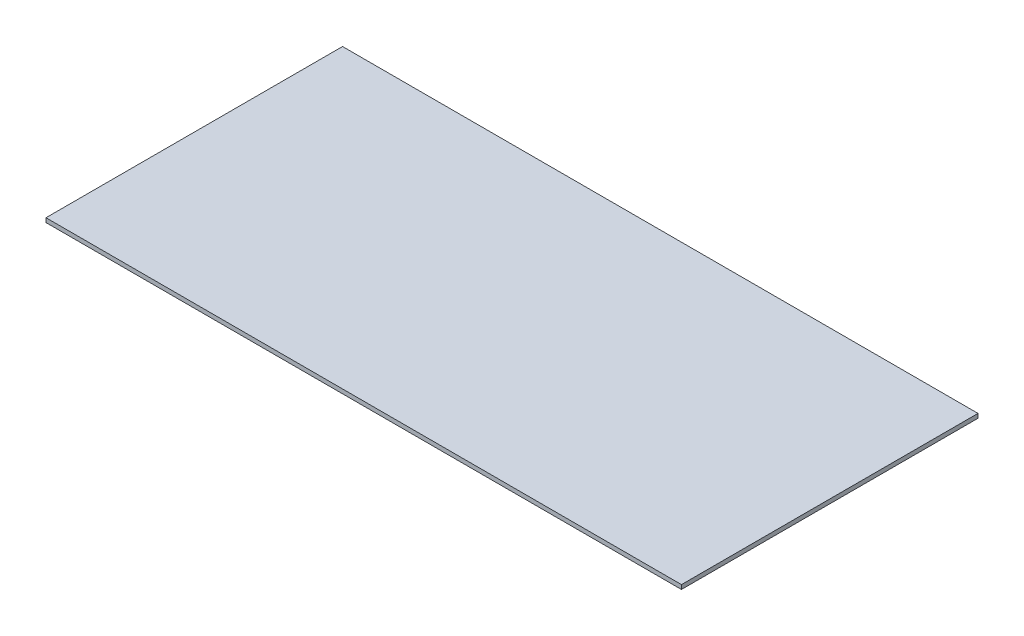
ISO-10303-21;
HEADER;
FILE_DESCRIPTION(('STEP AP214'),'2;1');
FILE_NAME('part.step','',(''),(''),'','','');
FILE_SCHEMA(('AUTOMOTIVE_DESIGN { 1 0 10303 214 1 1 1 1 }'));
ENDSEC;
DATA;
#1=APPLICATION_CONTEXT('core data for automotive mechanical design processes');
#2=APPLICATION_PROTOCOL_DEFINITION('international standard','automotive_design',2000,#1);
#3=PRODUCT_CONTEXT('',#1,'mechanical');
#4=PRODUCT('Part','Part','',(#3));
#5=PRODUCT_RELATED_PRODUCT_CATEGORY('part','',(#4));
#6=PRODUCT_DEFINITION_FORMATION('','',#4);
#7=PRODUCT_DEFINITION_CONTEXT('part definition',#1,'design');
#8=PRODUCT_DEFINITION('design','',#6,#7);
#9=PRODUCT_DEFINITION_SHAPE('','',#8);
#10=(LENGTH_UNIT() NAMED_UNIT(*) SI_UNIT(.MILLI.,.METRE.));
#11=(NAMED_UNIT(*) PLANE_ANGLE_UNIT() SI_UNIT($,.RADIAN.));
#12=(NAMED_UNIT(*) SI_UNIT($,.STERADIAN.) SOLID_ANGLE_UNIT());
#13=UNCERTAINTY_MEASURE_WITH_UNIT(LENGTH_MEASURE(1.E-05),#10,'distance_accuracy_value','');
#14=(GEOMETRIC_REPRESENTATION_CONTEXT(3) GLOBAL_UNCERTAINTY_ASSIGNED_CONTEXT((#13)) GLOBAL_UNIT_ASSIGNED_CONTEXT((#10,
#11,#12)) REPRESENTATION_CONTEXT('',''));
#15=CARTESIAN_POINT('',(0.,0.,0.));
#16=DIRECTION('',(0.,0.,1.));
#17=DIRECTION('',(1.,0.,0.));
#18=AXIS2_PLACEMENT_3D('',#15,#16,#17);
#19=CARTESIAN_POINT('',(450.,-3.,420.));
#20=DIRECTION('',(-1.,0.,0.));
#21=DIRECTION('',(0.,0.,1.));
#22=AXIS2_PLACEMENT_3D('',#19,#20,#21);
#23=PLANE('',#22);
#24=DIRECTION('',(0.,1.,0.));
#25=VECTOR('',#24,1.);
#26=CARTESIAN_POINT('',(450.,-3.,0.));
#27=LINE('',#26,#25);
#28=CARTESIAN_POINT('',(450.,-3.,0.));
#29=VERTEX_POINT('',#28);
#30=CARTESIAN_POINT('',(450.,3.,0.));
#31=VERTEX_POINT('',#30);
#32=EDGE_CURVE('E113',#29,#31,#27,.T.);
#33=ORIENTED_EDGE('',*,*,#32,.T.);
#34=DIRECTION('',(0.,0.,-1.));
#35=VECTOR('',#34,1.);
#36=CARTESIAN_POINT('',(450.,3.,420.));
#37=LINE('',#36,#35);
#38=CARTESIAN_POINT('',(450.,3.,420.));
#39=VERTEX_POINT('',#38);
#40=EDGE_CURVE('E11',#39,#31,#37,.T.);
#41=ORIENTED_EDGE('',*,*,#40,.F.);
#42=DIRECTION('',(0.,1.,0.));
#43=VECTOR('',#42,1.);
#44=CARTESIAN_POINT('',(450.,-3.,420.));
#45=LINE('',#44,#43);
#46=CARTESIAN_POINT('',(450.,-3.,420.));
#47=VERTEX_POINT('',#46);
#48=EDGE_CURVE('E97',#47,#39,#45,.T.);
#49=ORIENTED_EDGE('',*,*,#48,.F.);
#50=DIRECTION('',(0.,0.,-1.));
#51=VECTOR('',#50,1.);
#52=CARTESIAN_POINT('',(450.,-3.,420.));
#53=LINE('',#52,#51);
#54=EDGE_CURVE('E109',#47,#29,#53,.T.);
#55=ORIENTED_EDGE('',*,*,#54,.T.);
#56=EDGE_LOOP('',(#33,#41,#49,#55));
#57=FACE_BOUND('',#56,.T.);
#58=ADVANCED_FACE('F45',(#57),#23,.F.);
#59=CARTESIAN_POINT('',(-450.,3.,420.));
#60=DIRECTION('',(0.,-1.,0.));
#61=DIRECTION('',(0.,0.,-1.));
#62=AXIS2_PLACEMENT_3D('',#59,#60,#61);
#63=PLANE('',#62);
#64=DIRECTION('',(-1.,0.,0.));
#65=VECTOR('',#64,1.);
#66=CARTESIAN_POINT('',(-450.,3.,0.));
#67=LINE('',#66,#65);
#68=CARTESIAN_POINT('',(-450.,3.,0.));
#69=VERTEX_POINT('',#68);
#70=EDGE_CURVE('E102',#31,#69,#67,.T.);
#71=ORIENTED_EDGE('',*,*,#70,.T.);
#72=DIRECTION('',(0.,0.,-1.));
#73=VECTOR('',#72,1.);
#74=CARTESIAN_POINT('',(-450.,3.,420.));
#75=LINE('',#74,#73);
#76=CARTESIAN_POINT('',(-450.,3.,420.));
#77=VERTEX_POINT('',#76);
#78=EDGE_CURVE('E54',#77,#69,#75,.T.);
#79=ORIENTED_EDGE('',*,*,#78,.F.);
#80=DIRECTION('',(-1.,0.,0.));
#81=VECTOR('',#80,1.);
#82=CARTESIAN_POINT('',(-450.,3.,420.));
#83=LINE('',#82,#81);
#84=EDGE_CURVE('E92',#39,#77,#83,.T.);
#85=ORIENTED_EDGE('',*,*,#84,.F.);
#86=ORIENTED_EDGE('',*,*,#40,.T.);
#87=EDGE_LOOP('',(#71,#79,#85,#86));
#88=FACE_BOUND('',#87,.T.);
#89=ADVANCED_FACE('F101',(#88),#63,.F.);
#90=CARTESIAN_POINT('',(-450.,-3.,420.));
#91=DIRECTION('',(1.,0.,0.));
#92=DIRECTION('',(0.,0.,-1.));
#93=AXIS2_PLACEMENT_3D('',#90,#91,#92);
#94=PLANE('',#93);
#95=DIRECTION('',(0.,-1.,0.));
#96=VECTOR('',#95,1.);
#97=CARTESIAN_POINT('',(-450.,-3.,0.));
#98=LINE('',#97,#96);
#99=CARTESIAN_POINT('',(-450.,-3.,0.));
#100=VERTEX_POINT('',#99);
#101=EDGE_CURVE('E79',#69,#100,#98,.T.);
#102=ORIENTED_EDGE('',*,*,#101,.T.);
#103=DIRECTION('',(0.,0.,-1.));
#104=VECTOR('',#103,1.);
#105=CARTESIAN_POINT('',(-450.,-3.,420.));
#106=LINE('',#105,#104);
#107=CARTESIAN_POINT('',(-450.,-3.,420.));
#108=VERTEX_POINT('',#107);
#109=EDGE_CURVE('E104',#108,#100,#106,.T.);
#110=ORIENTED_EDGE('',*,*,#109,.F.);
#111=DIRECTION('',(0.,-1.,0.));
#112=VECTOR('',#111,1.);
#113=CARTESIAN_POINT('',(-450.,-3.,420.));
#114=LINE('',#113,#112);
#115=EDGE_CURVE('E95',#77,#108,#114,.T.);
#116=ORIENTED_EDGE('',*,*,#115,.F.);
#117=ORIENTED_EDGE('',*,*,#78,.T.);
#118=EDGE_LOOP('',(#102,#110,#116,#117));
#119=FACE_BOUND('',#118,.T.);
#120=ADVANCED_FACE('F105',(#119),#94,.F.);
#121=CARTESIAN_POINT('',(-450.,-3.,420.));
#122=DIRECTION('',(0.,1.,0.));
#123=DIRECTION('',(0.,0.,1.));
#124=AXIS2_PLACEMENT_3D('',#121,#122,#123);
#125=PLANE('',#124);
#126=DIRECTION('',(1.,0.,0.));
#127=VECTOR('',#126,1.);
#128=CARTESIAN_POINT('',(-450.,-3.,0.));
#129=LINE('',#128,#127);
#130=EDGE_CURVE('E85',#100,#29,#129,.T.);
#131=ORIENTED_EDGE('',*,*,#130,.T.);
#132=ORIENTED_EDGE('',*,*,#54,.F.);
#133=DIRECTION('',(1.,0.,0.));
#134=VECTOR('',#133,1.);
#135=CARTESIAN_POINT('',(-450.,-3.,420.));
#136=LINE('',#135,#134);
#137=EDGE_CURVE('E62',#108,#47,#136,.T.);
#138=ORIENTED_EDGE('',*,*,#137,.F.);
#139=ORIENTED_EDGE('',*,*,#109,.T.);
#140=EDGE_LOOP('',(#131,#132,#138,#139));
#141=FACE_BOUND('',#140,.T.);
#142=ADVANCED_FACE('F126',(#141),#125,.F.);
#143=CARTESIAN_POINT('',(0.,0.,420.));
#144=DIRECTION('',(0.,0.,-1.));
#145=DIRECTION('',(-1.,0.,0.));
#146=AXIS2_PLACEMENT_3D('',#143,#144,#145);
#147=PLANE('',#146);
#148=ORIENTED_EDGE('',*,*,#48,.T.);
#149=ORIENTED_EDGE('',*,*,#84,.T.);
#150=ORIENTED_EDGE('',*,*,#115,.T.);
#151=ORIENTED_EDGE('',*,*,#137,.T.);
#152=EDGE_LOOP('',(#148,#149,#150,#151));
#153=FACE_BOUND('',#152,.T.);
#154=ADVANCED_FACE('F93',(#153),#147,.F.);
#155=CARTESIAN_POINT('',(0.,0.,0.));
#156=DIRECTION('',(0.,0.,-1.));
#157=DIRECTION('',(-1.,0.,0.));
#158=AXIS2_PLACEMENT_3D('',#155,#156,#157);
#159=PLANE('',#158);
#160=ORIENTED_EDGE('',*,*,#32,.F.);
#161=ORIENTED_EDGE('',*,*,#130,.F.);
#162=ORIENTED_EDGE('',*,*,#101,.F.);
#163=ORIENTED_EDGE('',*,*,#70,.F.);
#164=EDGE_LOOP('',(#160,#161,#162,#163));
#165=FACE_BOUND('',#164,.T.);
#166=ADVANCED_FACE('F129',(#165),#159,.T.);
#167=CLOSED_SHELL('',(#58,#89,#120,#142,#154,#166));
#168=MANIFOLD_SOLID_BREP('B2',#167);
#169=ADVANCED_BREP_SHAPE_REPRESENTATION('',(#18,#168),#14);
#170=SHAPE_DEFINITION_REPRESENTATION(#9,#169);
ENDSEC;
END-ISO-10303-21;
